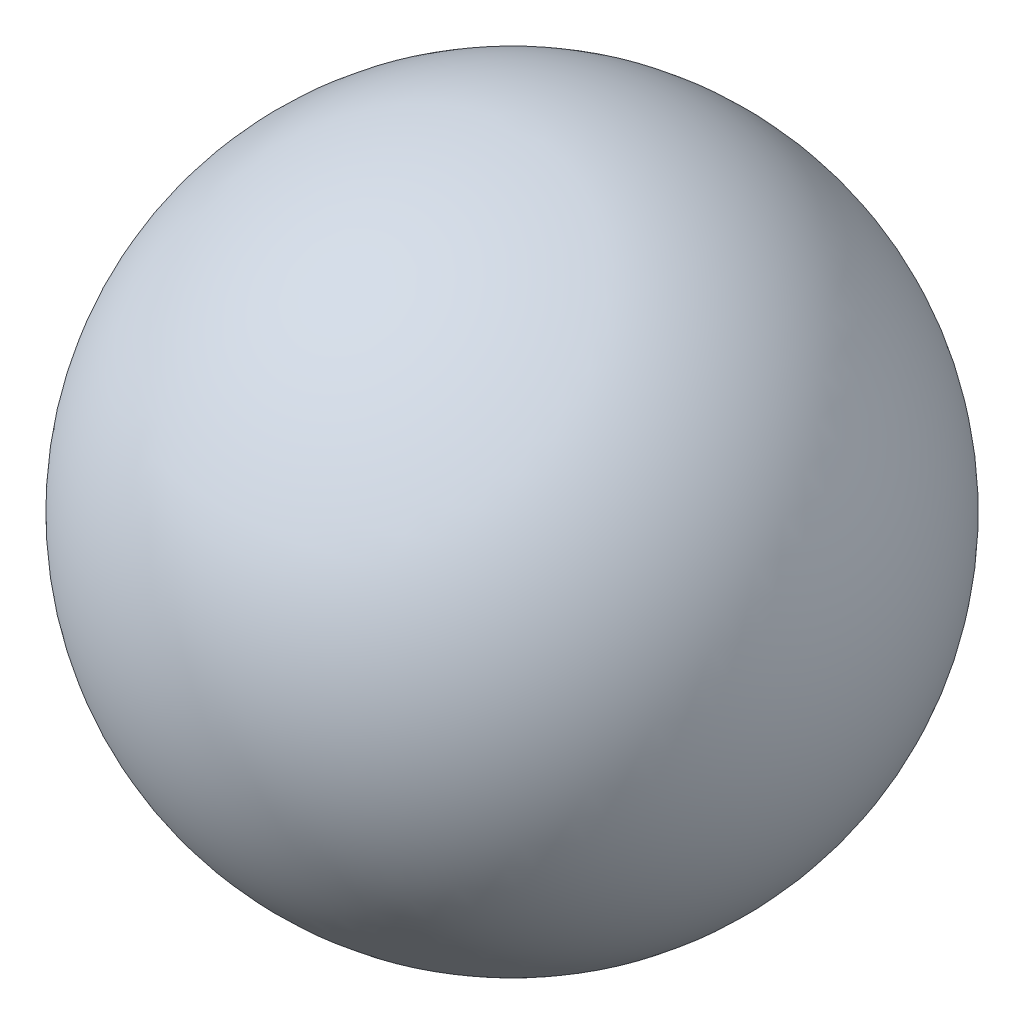
ISO-10303-21;
HEADER;
FILE_DESCRIPTION(('STEP AP214'),'2;1');
FILE_NAME('part.step','',(''),(''),'','','');
FILE_SCHEMA(('AUTOMOTIVE_DESIGN { 1 0 10303 214 1 1 1 1 }'));
ENDSEC;
DATA;
#1=APPLICATION_CONTEXT('core data for automotive mechanical design processes');
#2=APPLICATION_PROTOCOL_DEFINITION('international standard','automotive_design',2000,#1);
#3=PRODUCT_CONTEXT('',#1,'mechanical');
#4=PRODUCT('Part','Part','',(#3));
#5=PRODUCT_RELATED_PRODUCT_CATEGORY('part','',(#4));
#6=PRODUCT_DEFINITION_FORMATION('','',#4);
#7=PRODUCT_DEFINITION_CONTEXT('part definition',#1,'design');
#8=PRODUCT_DEFINITION('design','',#6,#7);
#9=PRODUCT_DEFINITION_SHAPE('','',#8);
#10=(LENGTH_UNIT() NAMED_UNIT(*) SI_UNIT(.MILLI.,.METRE.));
#11=(NAMED_UNIT(*) PLANE_ANGLE_UNIT() SI_UNIT($,.RADIAN.));
#12=(NAMED_UNIT(*) SI_UNIT($,.STERADIAN.) SOLID_ANGLE_UNIT());
#13=UNCERTAINTY_MEASURE_WITH_UNIT(LENGTH_MEASURE(1.E-05),#10,'distance_accuracy_value','');
#14=(GEOMETRIC_REPRESENTATION_CONTEXT(3) GLOBAL_UNCERTAINTY_ASSIGNED_CONTEXT((#13)) GLOBAL_UNIT_ASSIGNED_CONTEXT((#10,
#11,#12)) REPRESENTATION_CONTEXT('',''));
#15=CARTESIAN_POINT('',(0.,0.,0.));
#16=DIRECTION('',(0.,0.,1.));
#17=DIRECTION('',(1.,0.,0.));
#18=AXIS2_PLACEMENT_3D('',#15,#16,#17);
#19=CARTESIAN_POINT('',(0.,5.,0.));
#20=DIRECTION('',(0.,-1.,0.));
#21=DIRECTION('',(0.,0.,1.));
#22=AXIS2_PLACEMENT_3D('',#19,#20,#21);
#23=SPHERICAL_SURFACE('',#22,15.);
#24=CARTESIAN_POINT('',(0.,-10.,0.));
#25=VERTEX_POINT('',#24);
#26=VERTEX_LOOP('',#25);
#27=FACE_BOUND('',#26,.T.);
#28=ADVANCED_FACE('F31',(#27),#23,.T.);
#29=CLOSED_SHELL('',(#28));
#30=MANIFOLD_SOLID_BREP('B2',#29);
#31=ADVANCED_BREP_SHAPE_REPRESENTATION('',(#18,#30),#14);
#32=SHAPE_DEFINITION_REPRESENTATION(#9,#31);
ENDSEC;
END-ISO-10303-21;
